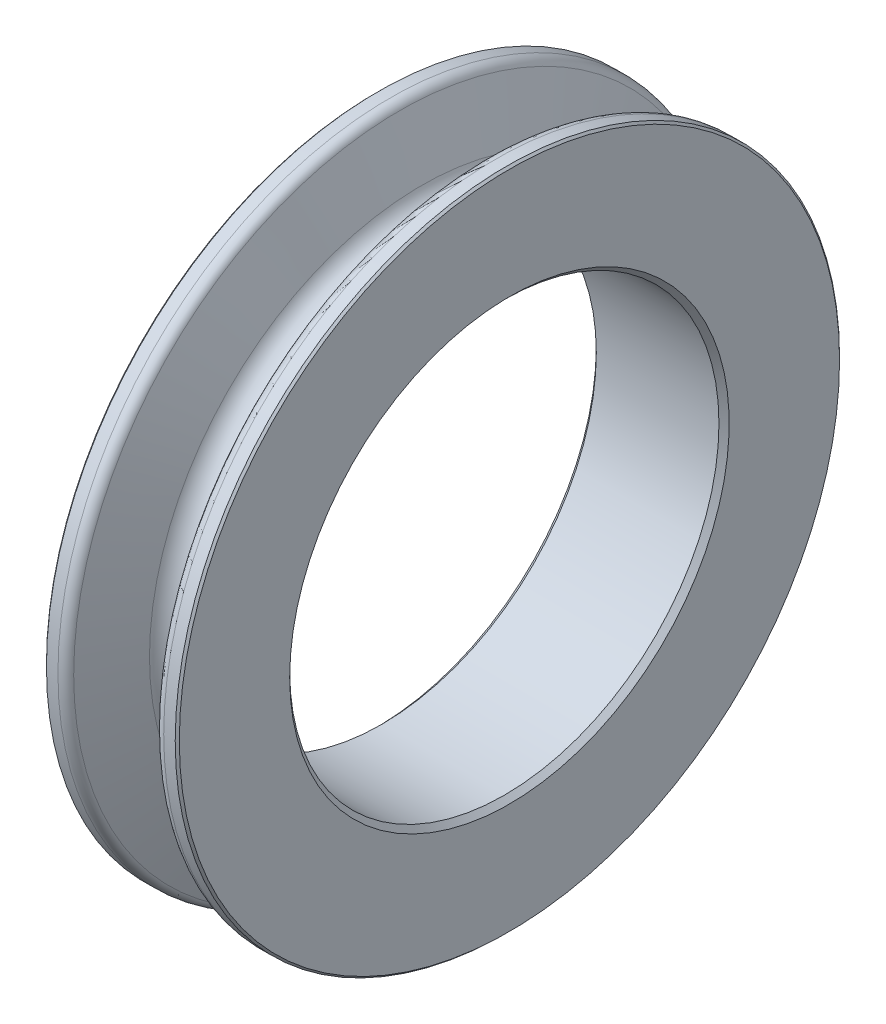
ISO-10303-21;
HEADER;
FILE_DESCRIPTION(('STEP AP214'),'2;1');
FILE_NAME('part.step','',(''),(''),'','','');
FILE_SCHEMA(('AUTOMOTIVE_DESIGN { 1 0 10303 214 1 1 1 1 }'));
ENDSEC;
DATA;
#1=APPLICATION_CONTEXT('core data for automotive mechanical design processes');
#2=APPLICATION_PROTOCOL_DEFINITION('international standard','automotive_design',2000,#1);
#3=PRODUCT_CONTEXT('',#1,'mechanical');
#4=PRODUCT('Part','Part','',(#3));
#5=PRODUCT_RELATED_PRODUCT_CATEGORY('part','',(#4));
#6=PRODUCT_DEFINITION_FORMATION('','',#4);
#7=PRODUCT_DEFINITION_CONTEXT('part definition',#1,'design');
#8=PRODUCT_DEFINITION('design','',#6,#7);
#9=PRODUCT_DEFINITION_SHAPE('','',#8);
#10=(LENGTH_UNIT() NAMED_UNIT(*) SI_UNIT(.MILLI.,.METRE.));
#11=(NAMED_UNIT(*) PLANE_ANGLE_UNIT() SI_UNIT($,.RADIAN.));
#12=(NAMED_UNIT(*) SI_UNIT($,.STERADIAN.) SOLID_ANGLE_UNIT());
#13=UNCERTAINTY_MEASURE_WITH_UNIT(LENGTH_MEASURE(1.E-05),#10,'distance_accuracy_value','');
#14=(GEOMETRIC_REPRESENTATION_CONTEXT(3) GLOBAL_UNCERTAINTY_ASSIGNED_CONTEXT((#13)) GLOBAL_UNIT_ASSIGNED_CONTEXT((#10,
#11,#12)) REPRESENTATION_CONTEXT('',''));
#15=CARTESIAN_POINT('',(0.,0.,0.));
#16=DIRECTION('',(0.,0.,1.));
#17=DIRECTION('',(1.,0.,0.));
#18=AXIS2_PLACEMENT_3D('',#15,#16,#17);
#19=CARTESIAN_POINT('',(0.,0.,0.));
#20=DIRECTION('',(-1.,0.,0.));
#21=DIRECTION('',(0.,0.,1.));
#22=AXIS2_PLACEMENT_3D('',#19,#20,#21);
#23=CYLINDRICAL_SURFACE('',#22,32.5);
#24=CARTESIAN_POINT('',(6.30000000000002,0.,0.));
#25=DIRECTION('',(-1.,0.,0.));
#26=DIRECTION('',(0.,0.,1.));
#27=AXIS2_PLACEMENT_3D('',#24,#25,#26);
#28=CIRCLE('',#27,32.5);
#29=CARTESIAN_POINT('',(6.30000000000002,0.,32.5));
#30=VERTEX_POINT('',#29);
#31=EDGE_CURVE('E53',#30,#30,#28,.T.);
#32=ORIENTED_EDGE('',*,*,#31,.T.);
#33=EDGE_LOOP('',(#32));
#34=FACE_BOUND('',#33,.T.);
#35=CARTESIAN_POINT('',(5.17462890044267,0.,0.));
#36=DIRECTION('',(1.,0.,0.));
#37=DIRECTION('',(0.,0.,-1.));
#38=AXIS2_PLACEMENT_3D('',#35,#36,#37);
#39=CIRCLE('',#38,32.5);
#40=CARTESIAN_POINT('',(5.17462890044267,0.,-32.5));
#41=VERTEX_POINT('',#40);
#42=EDGE_CURVE('E68',#41,#41,#39,.T.);
#43=ORIENTED_EDGE('',*,*,#42,.T.);
#44=EDGE_LOOP('',(#43));
#45=FACE_BOUND('',#44,.T.);
#46=ADVANCED_FACE('F30',(#34,#45),#23,.T.);
#47=CARTESIAN_POINT('',(4.50645026252337,0.,0.));
#48=DIRECTION('',(1.,0.,0.));
#49=DIRECTION('',(0.,0.,-1.));
#50=AXIS2_PLACEMENT_3D('',#47,#48,#49);
#51=CONICAL_SURFACE('',#50,32.5,1.17809724509617);
#52=CARTESIAN_POINT('',(4.25074936793138,0.,0.));
#53=DIRECTION('',(-1.,0.,0.));
#54=DIRECTION('',(0.,0.,1.));
#55=AXIS2_PLACEMENT_3D('',#52,#53,#54);
#56=CIRCLE('',#55,31.8826834323651);
#57=CARTESIAN_POINT('',(4.25074936793138,0.,31.8826834323651));
#58=VERTEX_POINT('',#57);
#59=EDGE_CURVE('E71',#58,#58,#56,.T.);
#60=ORIENTED_EDGE('',*,*,#59,.T.);
#61=EDGE_LOOP('',(#60));
#62=FACE_BOUND('',#61,.T.);
#63=CARTESIAN_POINT('',(2.0787289481504,0.,0.));
#64=DIRECTION('',(-1.,0.,0.));
#65=DIRECTION('',(0.,0.,1.));
#66=AXIS2_PLACEMENT_3D('',#63,#64,#65);
#67=CIRCLE('',#66,26.6389622771785);
#68=CARTESIAN_POINT('',(2.0787289481504,0.,26.6389622771785));
#69=VERTEX_POINT('',#68);
#70=EDGE_CURVE('E74',#69,#69,#67,.T.);
#71=ORIENTED_EDGE('',*,*,#70,.F.);
#72=EDGE_LOOP('',(#71));
#73=FACE_BOUND('',#72,.T.);
#74=ADVANCED_FACE('F86',(#62,#73),#51,.T.);
#75=CARTESIAN_POINT('',(0.,0.,0.));
#76=DIRECTION('',(-1.,0.,0.));
#77=DIRECTION('',(0.,0.,1.));
#78=AXIS2_PLACEMENT_3D('',#75,#76,#77);
#79=TOROIDAL_SURFACE('',#78,27.5,2.25);
#80=CARTESIAN_POINT('',(-2.0787289481504,0.,0.));
#81=DIRECTION('',(-1.,0.,0.));
#82=DIRECTION('',(0.,0.,1.));
#83=AXIS2_PLACEMENT_3D('',#80,#81,#82);
#84=CIRCLE('',#83,26.6389622771785);
#85=CARTESIAN_POINT('',(-2.0787289481504,0.,26.6389622771785));
#86=VERTEX_POINT('',#85);
#87=EDGE_CURVE('E77',#86,#86,#84,.T.);
#88=ORIENTED_EDGE('',*,*,#87,.F.);
#89=EDGE_LOOP('',(#88));
#90=FACE_BOUND('',#89,.T.);
#91=ORIENTED_EDGE('',*,*,#70,.T.);
#92=EDGE_LOOP('',(#91));
#93=FACE_BOUND('',#92,.T.);
#94=ADVANCED_FACE('F83',(#90,#93),#79,.F.);
#95=CARTESIAN_POINT('',(-2.0787289481504,0.,0.));
#96=DIRECTION('',(-1.,0.,0.));
#97=DIRECTION('',(0.,0.,1.));
#98=AXIS2_PLACEMENT_3D('',#95,#96,#97);
#99=CONICAL_SURFACE('',#98,26.6389622771785,1.17809724509617);
#100=CARTESIAN_POINT('',(-4.25074936793138,0.,0.));
#101=DIRECTION('',(1.,0.,0.));
#102=DIRECTION('',(0.,0.,-1.));
#103=AXIS2_PLACEMENT_3D('',#100,#101,#102);
#104=CIRCLE('',#103,31.8826834323651);
#105=CARTESIAN_POINT('',(-4.25074936793138,0.,-31.8826834323651));
#106=VERTEX_POINT('',#105);
#107=EDGE_CURVE('E62',#106,#106,#104,.T.);
#108=ORIENTED_EDGE('',*,*,#107,.T.);
#109=EDGE_LOOP('',(#108));
#110=FACE_BOUND('',#109,.T.);
#111=ORIENTED_EDGE('',*,*,#87,.T.);
#112=EDGE_LOOP('',(#111));
#113=FACE_BOUND('',#112,.T.);
#114=ADVANCED_FACE('F81',(#110,#113),#99,.T.);
#115=CARTESIAN_POINT('',(0.,0.,0.));
#116=DIRECTION('',(-1.,0.,0.));
#117=DIRECTION('',(0.,0.,1.));
#118=AXIS2_PLACEMENT_3D('',#115,#116,#117);
#119=CYLINDRICAL_SURFACE('',#118,32.5);
#120=CARTESIAN_POINT('',(-6.30000000000002,0.,0.));
#121=DIRECTION('',(1.,0.,0.));
#122=DIRECTION('',(0.,0.,-1.));
#123=AXIS2_PLACEMENT_3D('',#120,#121,#122);
#124=CIRCLE('',#123,32.5);
#125=CARTESIAN_POINT('',(-6.30000000000002,0.,-32.5));
#126=VERTEX_POINT('',#125);
#127=EDGE_CURVE('E56',#126,#126,#124,.T.);
#128=ORIENTED_EDGE('',*,*,#127,.T.);
#129=EDGE_LOOP('',(#128));
#130=FACE_BOUND('',#129,.T.);
#131=CARTESIAN_POINT('',(-5.17462890044267,0.,0.));
#132=DIRECTION('',(1.,0.,0.));
#133=DIRECTION('',(0.,0.,-1.));
#134=AXIS2_PLACEMENT_3D('',#131,#132,#133);
#135=CIRCLE('',#134,32.5);
#136=CARTESIAN_POINT('',(-5.17462890044267,0.,-32.5));
#137=VERTEX_POINT('',#136);
#138=EDGE_CURVE('E65',#137,#137,#135,.F.);
#139=ORIENTED_EDGE('',*,*,#138,.T.);
#140=EDGE_LOOP('',(#139));
#141=FACE_BOUND('',#140,.T.);
#142=ADVANCED_FACE('F138',(#130,#141),#119,.T.);
#143=CARTESIAN_POINT('',(-6.5,32.5,0.));
#144=DIRECTION('',(1.,0.,0.));
#145=DIRECTION('',(0.,0.,-1.));
#146=AXIS2_PLACEMENT_3D('',#143,#144,#145);
#147=PLANE('',#146);
#148=CARTESIAN_POINT('',(-6.5,0.,0.));
#149=DIRECTION('',(1.,0.,0.));
#150=DIRECTION('',(0.,0.,-1.));
#151=AXIS2_PLACEMENT_3D('',#148,#149,#150);
#152=CIRCLE('',#151,21.5);
#153=CARTESIAN_POINT('',(-6.5,0.,-21.5));
#154=VERTEX_POINT('',#153);
#155=EDGE_CURVE('E37',#154,#154,#152,.T.);
#156=ORIENTED_EDGE('',*,*,#155,.T.);
#157=EDGE_LOOP('',(#156));
#158=FACE_BOUND('',#157,.T.);
#159=CARTESIAN_POINT('',(-6.5,0.,0.));
#160=DIRECTION('',(1.,0.,0.));
#161=DIRECTION('',(0.,0.,-1.));
#162=AXIS2_PLACEMENT_3D('',#159,#160,#161);
#163=CIRCLE('',#162,32.3);
#164=CARTESIAN_POINT('',(-6.5,0.,-32.3));
#165=VERTEX_POINT('',#164);
#166=EDGE_CURVE('E59',#165,#165,#163,.F.);
#167=ORIENTED_EDGE('',*,*,#166,.T.);
#168=EDGE_LOOP('',(#167));
#169=FACE_BOUND('',#168,.T.);
#170=ADVANCED_FACE('F129',(#158,#169),#147,.F.);
#171=CARTESIAN_POINT('',(0.,0.,0.));
#172=DIRECTION('',(-1.,0.,0.));
#173=DIRECTION('',(0.,0.,1.));
#174=AXIS2_PLACEMENT_3D('',#171,#172,#173);
#175=CYLINDRICAL_SURFACE('',#174,21.);
#176=CARTESIAN_POINT('',(-6.00000000000001,0.,0.));
#177=DIRECTION('',(1.,0.,0.));
#178=DIRECTION('',(0.,0.,-1.));
#179=AXIS2_PLACEMENT_3D('',#176,#177,#178);
#180=CIRCLE('',#179,21.);
#181=CARTESIAN_POINT('',(-6.00000000000001,0.,-21.));
#182=VERTEX_POINT('',#181);
#183=EDGE_CURVE('E41',#182,#182,#180,.F.);
#184=ORIENTED_EDGE('',*,*,#183,.T.);
#185=EDGE_LOOP('',(#184));
#186=FACE_BOUND('',#185,.T.);
#187=CARTESIAN_POINT('',(6.00000000000001,0.,0.));
#188=DIRECTION('',(-1.,0.,0.));
#189=DIRECTION('',(0.,0.,1.));
#190=AXIS2_PLACEMENT_3D('',#187,#188,#189);
#191=CIRCLE('',#190,21.);
#192=CARTESIAN_POINT('',(6.00000000000001,0.,21.));
#193=VERTEX_POINT('',#192);
#194=EDGE_CURVE('E45',#193,#193,#191,.F.);
#195=ORIENTED_EDGE('',*,*,#194,.T.);
#196=EDGE_LOOP('',(#195));
#197=FACE_BOUND('',#196,.T.);
#198=ADVANCED_FACE('F126',(#186,#197),#175,.F.);
#199=CARTESIAN_POINT('',(6.5,32.5,0.));
#200=DIRECTION('',(-1.,0.,0.));
#201=DIRECTION('',(0.,0.,1.));
#202=AXIS2_PLACEMENT_3D('',#199,#200,#201);
#203=PLANE('',#202);
#204=CARTESIAN_POINT('',(6.5,0.,0.));
#205=DIRECTION('',(-1.,0.,0.));
#206=DIRECTION('',(0.,0.,1.));
#207=AXIS2_PLACEMENT_3D('',#204,#205,#206);
#208=CIRCLE('',#207,21.5);
#209=CARTESIAN_POINT('',(6.5,0.,21.5));
#210=VERTEX_POINT('',#209);
#211=EDGE_CURVE('E10',#210,#210,#208,.T.);
#212=ORIENTED_EDGE('',*,*,#211,.T.);
#213=EDGE_LOOP('',(#212));
#214=FACE_BOUND('',#213,.T.);
#215=CARTESIAN_POINT('',(6.5,0.,0.));
#216=DIRECTION('',(-1.,0.,0.));
#217=DIRECTION('',(0.,0.,1.));
#218=AXIS2_PLACEMENT_3D('',#215,#216,#217);
#219=CIRCLE('',#218,32.3);
#220=CARTESIAN_POINT('',(6.5,0.,32.3));
#221=VERTEX_POINT('',#220);
#222=EDGE_CURVE('E50',#221,#221,#219,.F.);
#223=ORIENTED_EDGE('',*,*,#222,.T.);
#224=EDGE_LOOP('',(#223));
#225=FACE_BOUND('',#224,.T.);
#226=ADVANCED_FACE('F104',(#214,#225),#203,.F.);
#227=CARTESIAN_POINT('',(5.17462890044267,0.,0.));
#228=DIRECTION('',(1.,0.,0.));
#229=DIRECTION('',(0.,0.,-1.));
#230=AXIS2_PLACEMENT_3D('',#227,#228,#229);
#231=TOROIDAL_SURFACE('',#230,31.5,1.);
#232=ORIENTED_EDGE('',*,*,#42,.F.);
#233=EDGE_LOOP('',(#232));
#234=FACE_BOUND('',#233,.T.);
#235=ORIENTED_EDGE('',*,*,#59,.F.);
#236=EDGE_LOOP('',(#235));
#237=FACE_BOUND('',#236,.T.);
#238=ADVANCED_FACE('F100',(#234,#237),#231,.T.);
#239=CARTESIAN_POINT('',(-5.17462890044267,0.,0.));
#240=DIRECTION('',(1.,0.,0.));
#241=DIRECTION('',(0.,0.,-1.));
#242=AXIS2_PLACEMENT_3D('',#239,#240,#241);
#243=TOROIDAL_SURFACE('',#242,31.5,1.);
#244=ORIENTED_EDGE('',*,*,#107,.F.);
#245=EDGE_LOOP('',(#244));
#246=FACE_BOUND('',#245,.T.);
#247=ORIENTED_EDGE('',*,*,#138,.F.);
#248=EDGE_LOOP('',(#247));
#249=FACE_BOUND('',#248,.T.);
#250=ADVANCED_FACE('F103',(#246,#249),#243,.T.);
#251=CARTESIAN_POINT('',(-6.5,0.,0.));
#252=DIRECTION('',(1.,0.,0.));
#253=DIRECTION('',(0.,0.,-1.));
#254=AXIS2_PLACEMENT_3D('',#251,#252,#253);
#255=CONICAL_SURFACE('',#254,32.3,0.785398163397466);
#256=ORIENTED_EDGE('',*,*,#127,.F.);
#257=EDGE_LOOP('',(#256));
#258=FACE_BOUND('',#257,.T.);
#259=ORIENTED_EDGE('',*,*,#166,.F.);
#260=EDGE_LOOP('',(#259));
#261=FACE_BOUND('',#260,.T.);
#262=ADVANCED_FACE('F108',(#258,#261),#255,.T.);
#263=CARTESIAN_POINT('',(6.30000000000002,0.,0.));
#264=DIRECTION('',(-1.,0.,0.));
#265=DIRECTION('',(0.,0.,1.));
#266=AXIS2_PLACEMENT_3D('',#263,#264,#265);
#267=CONICAL_SURFACE('',#266,32.5,0.785398163397466);
#268=CARTESIAN_POINT('',(6.5,0.,32.3));
#269=CARTESIAN_POINT('',(6.49791666666667,0.,32.3020833333333));
#270=CARTESIAN_POINT('',(6.49583333333334,0.,32.3041666666667));
#271=CARTESIAN_POINT('',(6.49166666666667,0.,32.3083333333334));
#272=CARTESIAN_POINT('',(6.48958333333334,0.,32.3104166666667));
#273=CARTESIAN_POINT('',(6.48541666666667,0.,32.3145833333333));
#274=CARTESIAN_POINT('',(6.48333333333334,0.,32.3166666666667));
#275=CARTESIAN_POINT('',(6.47916666666667,0.,32.3208333333333));
#276=CARTESIAN_POINT('',(6.47708333333334,0.,32.3229166666667));
#277=CARTESIAN_POINT('',(6.47291666666667,0.,32.3270833333333));
#278=CARTESIAN_POINT('',(6.47083333333334,0.,32.3291666666667));
#279=CARTESIAN_POINT('',(6.46666666666667,0.,32.3333333333333));
#280=CARTESIAN_POINT('',(6.46458333333334,0.,32.3354166666667));
#281=CARTESIAN_POINT('',(6.46041666666667,0.,32.3395833333333));
#282=CARTESIAN_POINT('',(6.45833333333334,0.,32.3416666666667));
#283=CARTESIAN_POINT('',(6.45416666666667,0.,32.3458333333333));
#284=CARTESIAN_POINT('',(6.45208333333334,0.,32.3479166666667));
#285=CARTESIAN_POINT('',(6.44791666666668,0.,32.3520833333333));
#286=CARTESIAN_POINT('',(6.44583333333334,0.,32.3541666666667));
#287=CARTESIAN_POINT('',(6.44166666666668,0.,32.3583333333333));
#288=CARTESIAN_POINT('',(6.43958333333334,0.,32.3604166666667));
#289=CARTESIAN_POINT('',(6.43541666666668,0.,32.3645833333333));
#290=CARTESIAN_POINT('',(6.43333333333334,0.,32.3666666666667));
#291=CARTESIAN_POINT('',(6.42916666666668,0.,32.3708333333333));
#292=CARTESIAN_POINT('',(6.42708333333334,0.,32.3729166666667));
#293=CARTESIAN_POINT('',(6.42291666666668,0.,32.3770833333333));
#294=CARTESIAN_POINT('',(6.42083333333334,0.,32.3791666666667));
#295=CARTESIAN_POINT('',(6.41666666666668,0.,32.3833333333333));
#296=CARTESIAN_POINT('',(6.41458333333335,0.,32.3854166666667));
#297=CARTESIAN_POINT('',(6.41041666666668,0.,32.3895833333333));
#298=CARTESIAN_POINT('',(6.40833333333335,0.,32.3916666666667));
#299=CARTESIAN_POINT('',(6.40416666666668,0.,32.3958333333333));
#300=CARTESIAN_POINT('',(6.40208333333335,0.,32.3979166666667));
#301=CARTESIAN_POINT('',(6.39791666666668,0.,32.4020833333333));
#302=CARTESIAN_POINT('',(6.39583333333335,0.,32.4041666666667));
#303=CARTESIAN_POINT('',(6.39166666666668,0.,32.4083333333333));
#304=CARTESIAN_POINT('',(6.38958333333335,0.,32.4104166666667));
#305=CARTESIAN_POINT('',(6.38541666666668,0.,32.4145833333333));
#306=CARTESIAN_POINT('',(6.38333333333335,0.,32.4166666666667));
#307=CARTESIAN_POINT('',(6.37916666666668,0.,32.4208333333333));
#308=CARTESIAN_POINT('',(6.37708333333335,0.,32.4229166666667));
#309=CARTESIAN_POINT('',(6.37291666666668,0.,32.4270833333333));
#310=CARTESIAN_POINT('',(6.37083333333335,0.,32.4291666666667));
#311=CARTESIAN_POINT('',(6.36666666666668,0.,32.4333333333333));
#312=CARTESIAN_POINT('',(6.36458333333335,0.,32.4354166666667));
#313=CARTESIAN_POINT('',(6.36041666666669,0.,32.4395833333333));
#314=CARTESIAN_POINT('',(6.35833333333335,0.,32.4416666666667));
#315=CARTESIAN_POINT('',(6.35416666666669,0.,32.4458333333333));
#316=CARTESIAN_POINT('',(6.35208333333335,0.,32.4479166666667));
#317=CARTESIAN_POINT('',(6.34791666666669,0.,32.4520833333333));
#318=CARTESIAN_POINT('',(6.34583333333335,0.,32.4541666666667));
#319=CARTESIAN_POINT('',(6.34166666666669,0.,32.4583333333333));
#320=CARTESIAN_POINT('',(6.33958333333335,0.,32.4604166666667));
#321=CARTESIAN_POINT('',(6.33541666666669,0.,32.4645833333333));
#322=CARTESIAN_POINT('',(6.33333333333335,0.,32.4666666666667));
#323=CARTESIAN_POINT('',(6.32916666666669,0.,32.4708333333333));
#324=CARTESIAN_POINT('',(6.32708333333335,0.,32.4729166666667));
#325=CARTESIAN_POINT('',(6.32291666666669,0.,32.4770833333333));
#326=CARTESIAN_POINT('',(6.32083333333336,0.,32.4791666666667));
#327=CARTESIAN_POINT('',(6.31666666666669,0.,32.4833333333333));
#328=CARTESIAN_POINT('',(6.31458333333336,0.,32.4854166666667));
#329=CARTESIAN_POINT('',(6.31041666666669,0.,32.4895833333333));
#330=CARTESIAN_POINT('',(6.30833333333336,0.,32.4916666666667));
#331=CARTESIAN_POINT('',(6.30416666666669,0.,32.4958333333333));
#332=CARTESIAN_POINT('',(6.30208333333336,0.,32.4979166666667));
#333=CARTESIAN_POINT('',(6.30000000000002,0.,32.5));
#334=B_SPLINE_CURVE_WITH_KNOTS('',3,(#268,#269,#270,#271,#272,#273,#274,#275,#276,#277,#278,
#279,#280,#281,#282,#283,#284,#285,#286,#287,#288,#289,#290,#291,#292,#293,#294,#295,#296,#297,
#298,#299,#300,#301,#302,#303,#304,#305,#306,#307,#308,#309,#310,#311,#312,#313,#314,#315,#316,
#317,#318,#319,#320,#321,#322,#323,#324,#325,#326,#327,#328,#329,#330,#331,#332,#333),
.UNSPECIFIED.,.F.,.F.,(4,2,2,2,2,2,2,2,2,2,2,2,2,2,2,2,2,2,2,2,2,2,2,2,2,2,2,2,2,2,2,2,4),(0.,
0.00883883476483087,0.0176776695296617,0.0265165042944926,0.0353553390593235,0.0441941738241543,
0.0530330085889852,0.0618718433538161,0.070710678118647,0.0795495128834778,0.0883883476483087,
0.0972271824131395,0.106066017177971,0.114904851942801,0.123743686707632,0.132582521472463,
0.141421356237294,0.150260191002125,0.159099025766956,0.167937860531791,0.176776695296622,
0.185615530061453,0.194454364826284,0.203293199591115,0.212132034355946,0.220970869120777,
0.229809703885608,0.238648538650439,0.24748737341527,0.256326208180101,0.265165042944932,
0.274003877709763,0.282842712474593),.UNSPECIFIED.);
#335=EDGE_CURVE('BSEAM112',#221,#30,#334,.T.);
#336=ORIENTED_EDGE('',*,*,#222,.F.);
#337=ORIENTED_EDGE('',*,*,#31,.F.);
#338=ORIENTED_EDGE('',*,*,#335,.T.);
#339=ORIENTED_EDGE('',*,*,#335,.F.);
#340=EDGE_LOOP('',(#336,#338,#337,#339));
#341=FACE_BOUND('',#340,.T.);
#342=ADVANCED_FACE('F112',(#341),#267,.T.);
#343=CARTESIAN_POINT('',(-6.00000000000001,0.,0.));
#344=DIRECTION('',(-1.,0.,0.));
#345=DIRECTION('',(0.,0.,1.));
#346=AXIS2_PLACEMENT_3D('',#343,#344,#345);
#347=CONICAL_SURFACE('',#346,21.,0.785398163397448);
#348=ORIENTED_EDGE('',*,*,#155,.F.);
#349=EDGE_LOOP('',(#348));
#350=FACE_BOUND('',#349,.T.);
#351=ORIENTED_EDGE('',*,*,#183,.F.);
#352=EDGE_LOOP('',(#351));
#353=FACE_BOUND('',#352,.T.);
#354=ADVANCED_FACE('F115',(#350,#353),#347,.F.);
#355=CARTESIAN_POINT('',(6.5,0.,0.));
#356=DIRECTION('',(1.,0.,0.));
#357=DIRECTION('',(0.,0.,-1.));
#358=AXIS2_PLACEMENT_3D('',#355,#356,#357);
#359=CONICAL_SURFACE('',#358,21.5,0.785398163397455);
#360=ORIENTED_EDGE('',*,*,#194,.F.);
#361=EDGE_LOOP('',(#360));
#362=FACE_BOUND('',#361,.T.);
#363=ORIENTED_EDGE('',*,*,#211,.F.);
#364=EDGE_LOOP('',(#363));
#365=FACE_BOUND('',#364,.T.);
#366=ADVANCED_FACE('F32',(#362,#365),#359,.F.);
#367=CLOSED_SHELL('',(#46,#74,#94,#114,#142,#170,#198,#226,#238,#250,#262,#342,#354,#366));
#368=MANIFOLD_SOLID_BREP('B2',#367);
#369=ADVANCED_BREP_SHAPE_REPRESENTATION('',(#18,#368),#14);
#370=SHAPE_DEFINITION_REPRESENTATION(#9,#369);
ENDSEC;
END-ISO-10303-21;
